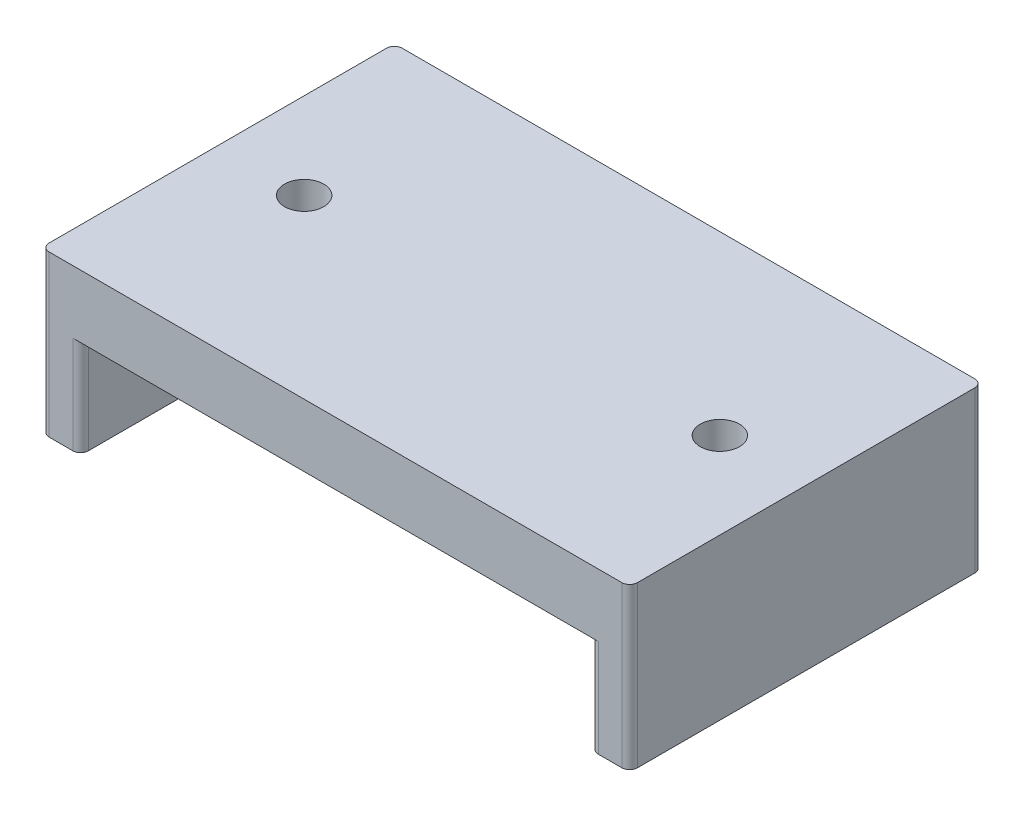
ISO-10303-21;
HEADER;
FILE_DESCRIPTION(('STEP AP214'),'2;1');
FILE_NAME('part.step','',(''),(''),'','','');
FILE_SCHEMA(('AUTOMOTIVE_DESIGN { 1 0 10303 214 1 1 1 1 }'));
ENDSEC;
DATA;
#1=APPLICATION_CONTEXT('core data for automotive mechanical design processes');
#2=APPLICATION_PROTOCOL_DEFINITION('international standard','automotive_design',2000,#1);
#3=PRODUCT_CONTEXT('',#1,'mechanical');
#4=PRODUCT('Part','Part','',(#3));
#5=PRODUCT_RELATED_PRODUCT_CATEGORY('part','',(#4));
#6=PRODUCT_DEFINITION_FORMATION('','',#4);
#7=PRODUCT_DEFINITION_CONTEXT('part definition',#1,'design');
#8=PRODUCT_DEFINITION('design','',#6,#7);
#9=PRODUCT_DEFINITION_SHAPE('','',#8);
#10=(LENGTH_UNIT() NAMED_UNIT(*) SI_UNIT(.MILLI.,.METRE.));
#11=(NAMED_UNIT(*) PLANE_ANGLE_UNIT() SI_UNIT($,.RADIAN.));
#12=(NAMED_UNIT(*) SI_UNIT($,.STERADIAN.) SOLID_ANGLE_UNIT());
#13=UNCERTAINTY_MEASURE_WITH_UNIT(LENGTH_MEASURE(1.E-05),#10,'distance_accuracy_value','');
#14=(GEOMETRIC_REPRESENTATION_CONTEXT(3) GLOBAL_UNCERTAINTY_ASSIGNED_CONTEXT((#13)) GLOBAL_UNIT_ASSIGNED_CONTEXT((#10,
#11,#12)) REPRESENTATION_CONTEXT('',''));
#15=CARTESIAN_POINT('',(0.,0.,0.));
#16=DIRECTION('',(0.,0.,1.));
#17=DIRECTION('',(1.,0.,0.));
#18=AXIS2_PLACEMENT_3D('',#15,#16,#17);
#19=CARTESIAN_POINT('',(0.,20.45,45.));
#20=DIRECTION('',(1.,0.,0.));
#21=DIRECTION('',(0.,1.,0.));
#22=AXIS2_PLACEMENT_3D('',#19,#20,#21);
#23=PLANE('',#22);
#24=DIRECTION('',(0.,0.,-1.));
#25=VECTOR('',#24,1.);
#26=CARTESIAN_POINT('',(0.,20.45,45.));
#27=LINE('',#26,#25);
#28=CARTESIAN_POINT('',(0.,20.45,44.));
#29=VERTEX_POINT('',#28);
#30=CARTESIAN_POINT('',(0.,20.45,1.00000000000001));
#31=VERTEX_POINT('',#30);
#32=EDGE_CURVE('E186',#29,#31,#27,.T.);
#33=ORIENTED_EDGE('',*,*,#32,.T.);
#34=DIRECTION('',(0.,-1.,0.));
#35=VECTOR('',#34,1.);
#36=CARTESIAN_POINT('',(0.,20.45,1.));
#37=LINE('',#36,#35);
#38=CARTESIAN_POINT('',(0.,0.,1.00000000000001));
#39=VERTEX_POINT('',#38);
#40=EDGE_CURVE('E266',#31,#39,#37,.T.);
#41=ORIENTED_EDGE('',*,*,#40,.T.);
#42=DIRECTION('',(0.,0.,-1.));
#43=VECTOR('',#42,1.);
#44=CARTESIAN_POINT('',(0.,0.,45.));
#45=LINE('',#44,#43);
#46=CARTESIAN_POINT('',(0.,0.,44.));
#47=VERTEX_POINT('',#46);
#48=EDGE_CURVE('E214',#47,#39,#45,.T.);
#49=ORIENTED_EDGE('',*,*,#48,.F.);
#50=DIRECTION('',(0.,-1.,0.));
#51=VECTOR('',#50,1.);
#52=CARTESIAN_POINT('',(0.,20.45,44.));
#53=LINE('',#52,#51);
#54=EDGE_CURVE('E151',#47,#29,#53,.F.);
#55=ORIENTED_EDGE('',*,*,#54,.T.);
#56=EDGE_LOOP('',(#33,#41,#49,#55));
#57=FACE_BOUND('',#56,.T.);
#58=ADVANCED_FACE('F33',(#57),#23,.F.);
#59=CARTESIAN_POINT('',(0.,0.,45.));
#60=DIRECTION('',(0.,1.,0.));
#61=DIRECTION('',(0.,0.,1.));
#62=AXIS2_PLACEMENT_3D('',#59,#60,#61);
#63=PLANE('',#62);
#64=DIRECTION('',(1.,0.,0.));
#65=VECTOR('',#64,1.);
#66=CARTESIAN_POINT('',(0.,0.,0.));
#67=LINE('',#66,#65);
#68=CARTESIAN_POINT('',(1.,0.,0.));
#69=VERTEX_POINT('',#68);
#70=CARTESIAN_POINT('',(4.,0.,0.));
#71=VERTEX_POINT('',#70);
#72=EDGE_CURVE('E187',#69,#71,#67,.T.);
#73=ORIENTED_EDGE('',*,*,#72,.T.);
#74=CARTESIAN_POINT('',(4.,0.,1.));
#75=DIRECTION('',(0.,1.,0.));
#76=DIRECTION('',(0.,0.,1.));
#77=AXIS2_PLACEMENT_3D('',#74,#75,#76);
#78=CIRCLE('',#77,1.);
#79=CARTESIAN_POINT('',(5.,0.,1.00000000000001));
#80=VERTEX_POINT('',#79);
#81=EDGE_CURVE('E263',#71,#80,#78,.F.);
#82=ORIENTED_EDGE('',*,*,#81,.T.);
#83=DIRECTION('',(0.,0.,-1.));
#84=VECTOR('',#83,1.);
#85=CARTESIAN_POINT('',(5.,0.,45.));
#86=LINE('',#85,#84);
#87=CARTESIAN_POINT('',(5.,0.,44.));
#88=VERTEX_POINT('',#87);
#89=EDGE_CURVE('E211',#88,#80,#86,.T.);
#90=ORIENTED_EDGE('',*,*,#89,.F.);
#91=CARTESIAN_POINT('',(4.,0.,44.));
#92=DIRECTION('',(0.,1.,0.));
#93=DIRECTION('',(0.,0.,1.));
#94=AXIS2_PLACEMENT_3D('',#91,#92,#93);
#95=CIRCLE('',#94,1.);
#96=CARTESIAN_POINT('',(4.,0.,45.));
#97=VERTEX_POINT('',#96);
#98=EDGE_CURVE('E152',#88,#97,#95,.F.);
#99=ORIENTED_EDGE('',*,*,#98,.T.);
#100=DIRECTION('',(1.,0.,0.));
#101=VECTOR('',#100,1.);
#102=CARTESIAN_POINT('',(0.,0.,45.));
#103=LINE('',#102,#101);
#104=CARTESIAN_POINT('',(1.,0.,45.));
#105=VERTEX_POINT('',#104);
#106=EDGE_CURVE('E159',#105,#97,#103,.T.);
#107=ORIENTED_EDGE('',*,*,#106,.F.);
#108=CARTESIAN_POINT('',(1.,0.,44.));
#109=DIRECTION('',(0.,1.,0.));
#110=DIRECTION('',(0.,0.,1.));
#111=AXIS2_PLACEMENT_3D('',#108,#109,#110);
#112=CIRCLE('',#111,1.);
#113=EDGE_CURVE('E56',#105,#47,#112,.F.);
#114=ORIENTED_EDGE('',*,*,#113,.T.);
#115=ORIENTED_EDGE('',*,*,#48,.T.);
#116=CARTESIAN_POINT('',(1.,0.,1.));
#117=DIRECTION('',(0.,1.,0.));
#118=DIRECTION('',(0.,0.,1.));
#119=AXIS2_PLACEMENT_3D('',#116,#117,#118);
#120=CIRCLE('',#119,1.);
#121=EDGE_CURVE('E48',#39,#69,#120,.F.);
#122=ORIENTED_EDGE('',*,*,#121,.T.);
#123=EDGE_LOOP('',(#73,#82,#90,#99,#107,#114,#115,#122));
#124=FACE_BOUND('',#123,.T.);
#125=ADVANCED_FACE('F168',(#124),#63,.F.);
#126=CARTESIAN_POINT('',(5.,0.,45.));
#127=DIRECTION('',(-1.,0.,0.));
#128=DIRECTION('',(0.,0.,1.));
#129=AXIS2_PLACEMENT_3D('',#126,#127,#128);
#130=PLANE('',#129);
#131=ORIENTED_EDGE('',*,*,#89,.T.);
#132=DIRECTION('',(0.,1.,0.));
#133=VECTOR('',#132,1.);
#134=CARTESIAN_POINT('',(5.,0.,1.));
#135=LINE('',#134,#133);
#136=CARTESIAN_POINT('',(5.,12.45,1.00000000000001));
#137=VERTEX_POINT('',#136);
#138=EDGE_CURVE('E258',#80,#137,#135,.T.);
#139=ORIENTED_EDGE('',*,*,#138,.T.);
#140=DIRECTION('',(0.,0.,-1.));
#141=VECTOR('',#140,1.);
#142=CARTESIAN_POINT('',(5.,12.45,45.));
#143=LINE('',#142,#141);
#144=CARTESIAN_POINT('',(5.,12.45,44.));
#145=VERTEX_POINT('',#144);
#146=EDGE_CURVE('E208',#145,#137,#143,.T.);
#147=ORIENTED_EDGE('',*,*,#146,.F.);
#148=DIRECTION('',(0.,1.,0.));
#149=VECTOR('',#148,1.);
#150=CARTESIAN_POINT('',(5.,0.,44.));
#151=LINE('',#150,#149);
#152=EDGE_CURVE('E256',#145,#88,#151,.F.);
#153=ORIENTED_EDGE('',*,*,#152,.T.);
#154=EDGE_LOOP('',(#131,#139,#147,#153));
#155=FACE_BOUND('',#154,.T.);
#156=ADVANCED_FACE('F327',(#155),#130,.F.);
#157=CARTESIAN_POINT('',(5.,12.45,45.));
#158=DIRECTION('',(0.,1.,0.));
#159=DIRECTION('',(0.,0.,1.));
#160=AXIS2_PLACEMENT_3D('',#157,#158,#159);
#161=PLANE('',#160);
#162=CARTESIAN_POINT('',(11.,12.45,22.5));
#163=DIRECTION('',(0.,-1.,0.));
#164=DIRECTION('',(0.,0.,-1.));
#165=AXIS2_PLACEMENT_3D('',#162,#163,#164);
#166=CIRCLE('',#165,2.49999999999999);
#167=CARTESIAN_POINT('',(11.,12.45,20.));
#168=VERTEX_POINT('',#167);
#169=EDGE_CURVE('E499',#168,#168,#166,.T.);
#170=ORIENTED_EDGE('',*,*,#169,.F.);
#171=EDGE_LOOP('',(#170));
#172=FACE_BOUND('',#171,.T.);
#173=CARTESIAN_POINT('',(64.,12.45,22.5));
#174=DIRECTION('',(0.,-1.,0.));
#175=DIRECTION('',(0.,0.,-1.));
#176=AXIS2_PLACEMENT_3D('',#173,#174,#175);
#177=CIRCLE('',#176,2.5);
#178=CARTESIAN_POINT('',(64.,12.45,20.));
#179=VERTEX_POINT('',#178);
#180=EDGE_CURVE('E180',#179,#179,#177,.T.);
#181=ORIENTED_EDGE('',*,*,#180,.F.);
#182=EDGE_LOOP('',(#181));
#183=FACE_BOUND('',#182,.T.);
#184=DIRECTION('',(1.,0.,0.));
#185=VECTOR('',#184,1.);
#186=CARTESIAN_POINT('',(5.,12.45,0.));
#187=LINE('',#186,#185);
#188=CARTESIAN_POINT('',(4.,12.45,0.));
#189=VERTEX_POINT('',#188);
#190=CARTESIAN_POINT('',(71.,12.45,0.));
#191=VERTEX_POINT('',#190);
#192=EDGE_CURVE('E189',#189,#191,#187,.T.);
#193=ORIENTED_EDGE('',*,*,#192,.T.);
#194=CARTESIAN_POINT('',(71.,12.45,1.));
#195=DIRECTION('',(0.,1.,0.));
#196=DIRECTION('',(0.,0.,1.));
#197=AXIS2_PLACEMENT_3D('',#194,#195,#196);
#198=CIRCLE('',#197,1.);
#199=CARTESIAN_POINT('',(70.,12.45,1.00000000000001));
#200=VERTEX_POINT('',#199);
#201=EDGE_CURVE('E271',#191,#200,#198,.T.);
#202=ORIENTED_EDGE('',*,*,#201,.T.);
#203=DIRECTION('',(0.,0.,-1.));
#204=VECTOR('',#203,1.);
#205=CARTESIAN_POINT('',(70.,12.45,45.));
#206=LINE('',#205,#204);
#207=CARTESIAN_POINT('',(70.,12.45,44.));
#208=VERTEX_POINT('',#207);
#209=EDGE_CURVE('E205',#208,#200,#206,.T.);
#210=ORIENTED_EDGE('',*,*,#209,.F.);
#211=CARTESIAN_POINT('',(71.,12.45,44.));
#212=DIRECTION('',(0.,1.,0.));
#213=DIRECTION('',(0.,0.,1.));
#214=AXIS2_PLACEMENT_3D('',#211,#212,#213);
#215=CIRCLE('',#214,1.);
#216=CARTESIAN_POINT('',(71.,12.45,45.));
#217=VERTEX_POINT('',#216);
#218=EDGE_CURVE('E268',#208,#217,#215,.T.);
#219=ORIENTED_EDGE('',*,*,#218,.T.);
#220=DIRECTION('',(1.,0.,0.));
#221=VECTOR('',#220,1.);
#222=CARTESIAN_POINT('',(5.,12.45,45.));
#223=LINE('',#222,#221);
#224=CARTESIAN_POINT('',(4.,12.45,45.));
#225=VERTEX_POINT('',#224);
#226=EDGE_CURVE('E171',#225,#217,#223,.T.);
#227=ORIENTED_EDGE('',*,*,#226,.F.);
#228=CARTESIAN_POINT('',(4.,12.45,44.));
#229=DIRECTION('',(0.,1.,0.));
#230=DIRECTION('',(0.,0.,1.));
#231=AXIS2_PLACEMENT_3D('',#228,#229,#230);
#232=CIRCLE('',#231,1.);
#233=EDGE_CURVE('E11',#225,#145,#232,.T.);
#234=ORIENTED_EDGE('',*,*,#233,.T.);
#235=ORIENTED_EDGE('',*,*,#146,.T.);
#236=CARTESIAN_POINT('',(4.,12.45,1.));
#237=DIRECTION('',(0.,1.,0.));
#238=DIRECTION('',(0.,0.,1.));
#239=AXIS2_PLACEMENT_3D('',#236,#237,#238);
#240=CIRCLE('',#239,1.);
#241=EDGE_CURVE('E41',#137,#189,#240,.T.);
#242=ORIENTED_EDGE('',*,*,#241,.T.);
#243=EDGE_LOOP('',(#193,#202,#210,#219,#227,#234,#235,#242));
#244=FACE_BOUND('',#243,.T.);
#245=ADVANCED_FACE('F275',(#172,#183,#244),#161,.F.);
#246=CARTESIAN_POINT('',(70.,12.45,45.));
#247=DIRECTION('',(1.,0.,0.));
#248=DIRECTION('',(0.,0.,-1.));
#249=AXIS2_PLACEMENT_3D('',#246,#247,#248);
#250=PLANE('',#249);
#251=DIRECTION('',(0.,0.,-1.));
#252=VECTOR('',#251,1.);
#253=CARTESIAN_POINT('',(70.,0.,45.));
#254=LINE('',#253,#252);
#255=CARTESIAN_POINT('',(70.,0.,44.));
#256=VERTEX_POINT('',#255);
#257=CARTESIAN_POINT('',(70.,0.,1.00000000000001));
#258=VERTEX_POINT('',#257);
#259=EDGE_CURVE('E202',#256,#258,#254,.T.);
#260=ORIENTED_EDGE('',*,*,#259,.F.);
#261=DIRECTION('',(0.,-1.,0.));
#262=VECTOR('',#261,1.);
#263=CARTESIAN_POINT('',(70.,12.45,44.));
#264=LINE('',#263,#262);
#265=EDGE_CURVE('E232',#256,#208,#264,.F.);
#266=ORIENTED_EDGE('',*,*,#265,.T.);
#267=ORIENTED_EDGE('',*,*,#209,.T.);
#268=DIRECTION('',(0.,-1.,0.));
#269=VECTOR('',#268,1.);
#270=CARTESIAN_POINT('',(70.,12.45,1.));
#271=LINE('',#270,#269);
#272=EDGE_CURVE('E229',#200,#258,#271,.T.);
#273=ORIENTED_EDGE('',*,*,#272,.T.);
#274=EDGE_LOOP('',(#260,#266,#267,#273));
#275=FACE_BOUND('',#274,.T.);
#276=ADVANCED_FACE('F316',(#275),#250,.F.);
#277=CARTESIAN_POINT('',(70.,0.,45.));
#278=DIRECTION('',(0.,1.,0.));
#279=DIRECTION('',(0.,0.,1.));
#280=AXIS2_PLACEMENT_3D('',#277,#278,#279);
#281=PLANE('',#280);
#282=DIRECTION('',(1.,0.,0.));
#283=VECTOR('',#282,1.);
#284=CARTESIAN_POINT('',(70.,0.,45.));
#285=LINE('',#284,#283);
#286=CARTESIAN_POINT('',(71.,0.,45.));
#287=VERTEX_POINT('',#286);
#288=CARTESIAN_POINT('',(74.,0.,45.));
#289=VERTEX_POINT('',#288);
#290=EDGE_CURVE('E174',#287,#289,#285,.T.);
#291=ORIENTED_EDGE('',*,*,#290,.F.);
#292=CARTESIAN_POINT('',(71.,0.,44.));
#293=DIRECTION('',(0.,1.,0.));
#294=DIRECTION('',(0.,0.,1.));
#295=AXIS2_PLACEMENT_3D('',#292,#293,#294);
#296=CIRCLE('',#295,1.);
#297=EDGE_CURVE('E227',#287,#256,#296,.F.);
#298=ORIENTED_EDGE('',*,*,#297,.T.);
#299=ORIENTED_EDGE('',*,*,#259,.T.);
#300=CARTESIAN_POINT('',(71.,0.,1.));
#301=DIRECTION('',(0.,1.,0.));
#302=DIRECTION('',(0.,0.,1.));
#303=AXIS2_PLACEMENT_3D('',#300,#301,#302);
#304=CIRCLE('',#303,1.);
#305=CARTESIAN_POINT('',(71.,0.,0.));
#306=VERTEX_POINT('',#305);
#307=EDGE_CURVE('E223',#258,#306,#304,.F.);
#308=ORIENTED_EDGE('',*,*,#307,.T.);
#309=DIRECTION('',(1.,0.,0.));
#310=VECTOR('',#309,1.);
#311=CARTESIAN_POINT('',(70.,0.,0.));
#312=LINE('',#311,#310);
#313=CARTESIAN_POINT('',(74.,0.,0.));
#314=VERTEX_POINT('',#313);
#315=EDGE_CURVE('E177',#306,#314,#312,.T.);
#316=ORIENTED_EDGE('',*,*,#315,.T.);
#317=CARTESIAN_POINT('',(74.,0.,1.));
#318=DIRECTION('',(0.,1.,0.));
#319=DIRECTION('',(0.,0.,1.));
#320=AXIS2_PLACEMENT_3D('',#317,#318,#319);
#321=CIRCLE('',#320,1.);
#322=CARTESIAN_POINT('',(75.,0.,1.00000000000001));
#323=VERTEX_POINT('',#322);
#324=EDGE_CURVE('E221',#314,#323,#321,.F.);
#325=ORIENTED_EDGE('',*,*,#324,.T.);
#326=DIRECTION('',(0.,0.,-1.));
#327=VECTOR('',#326,1.);
#328=CARTESIAN_POINT('',(75.,0.,45.));
#329=LINE('',#328,#327);
#330=CARTESIAN_POINT('',(75.,0.,44.));
#331=VERTEX_POINT('',#330);
#332=EDGE_CURVE('E199',#331,#323,#329,.T.);
#333=ORIENTED_EDGE('',*,*,#332,.F.);
#334=CARTESIAN_POINT('',(74.,0.,44.));
#335=DIRECTION('',(0.,1.,0.));
#336=DIRECTION('',(0.,0.,1.));
#337=AXIS2_PLACEMENT_3D('',#334,#335,#336);
#338=CIRCLE('',#337,1.);
#339=EDGE_CURVE('E225',#331,#289,#338,.F.);
#340=ORIENTED_EDGE('',*,*,#339,.T.);
#341=EDGE_LOOP('',(#291,#298,#299,#308,#316,#325,#333,#340));
#342=FACE_BOUND('',#341,.T.);
#343=ADVANCED_FACE('F300',(#342),#281,.F.);
#344=CARTESIAN_POINT('',(75.,0.,45.));
#345=DIRECTION('',(-1.,0.,0.));
#346=DIRECTION('',(0.,0.,1.));
#347=AXIS2_PLACEMENT_3D('',#344,#345,#346);
#348=PLANE('',#347);
#349=DIRECTION('',(0.,0.,-1.));
#350=VECTOR('',#349,1.);
#351=CARTESIAN_POINT('',(75.,20.45,45.));
#352=LINE('',#351,#350);
#353=CARTESIAN_POINT('',(75.,20.45,44.));
#354=VERTEX_POINT('',#353);
#355=CARTESIAN_POINT('',(75.,20.45,1.00000000000001));
#356=VERTEX_POINT('',#355);
#357=EDGE_CURVE('E196',#354,#356,#352,.T.);
#358=ORIENTED_EDGE('',*,*,#357,.F.);
#359=DIRECTION('',(0.,1.,0.));
#360=VECTOR('',#359,1.);
#361=CARTESIAN_POINT('',(75.,0.,44.));
#362=LINE('',#361,#360);
#363=EDGE_CURVE('E245',#354,#331,#362,.F.);
#364=ORIENTED_EDGE('',*,*,#363,.T.);
#365=ORIENTED_EDGE('',*,*,#332,.T.);
#366=DIRECTION('',(0.,1.,0.));
#367=VECTOR('',#366,1.);
#368=CARTESIAN_POINT('',(75.,0.,1.));
#369=LINE('',#368,#367);
#370=EDGE_CURVE('E242',#323,#356,#369,.T.);
#371=ORIENTED_EDGE('',*,*,#370,.T.);
#372=EDGE_LOOP('',(#358,#364,#365,#371));
#373=FACE_BOUND('',#372,.T.);
#374=ADVANCED_FACE('F304',(#373),#348,.F.);
#375=CARTESIAN_POINT('',(75.,20.45,45.));
#376=DIRECTION('',(0.,-1.,0.));
#377=DIRECTION('',(1.,0.,0.));
#378=AXIS2_PLACEMENT_3D('',#375,#376,#377);
#379=PLANE('',#378);
#380=CARTESIAN_POINT('',(11.,20.45,22.5));
#381=DIRECTION('',(0.,-1.,0.));
#382=DIRECTION('',(0.,0.,-1.));
#383=AXIS2_PLACEMENT_3D('',#380,#381,#382);
#384=CIRCLE('',#383,2.49999999999999);
#385=CARTESIAN_POINT('',(11.,20.45,20.));
#386=VERTEX_POINT('',#385);
#387=EDGE_CURVE('E190',#386,#386,#384,.T.);
#388=ORIENTED_EDGE('',*,*,#387,.T.);
#389=EDGE_LOOP('',(#388));
#390=FACE_BOUND('',#389,.T.);
#391=CARTESIAN_POINT('',(64.,20.45,22.5));
#392=DIRECTION('',(0.,-1.,0.));
#393=DIRECTION('',(0.,0.,-1.));
#394=AXIS2_PLACEMENT_3D('',#391,#392,#393);
#395=CIRCLE('',#394,2.5);
#396=CARTESIAN_POINT('',(64.,20.45,20.));
#397=VERTEX_POINT('',#396);
#398=EDGE_CURVE('E495',#397,#397,#395,.T.);
#399=ORIENTED_EDGE('',*,*,#398,.T.);
#400=EDGE_LOOP('',(#399));
#401=FACE_BOUND('',#400,.T.);
#402=DIRECTION('',(-1.,0.,0.));
#403=VECTOR('',#402,1.);
#404=CARTESIAN_POINT('',(75.,20.45,45.));
#405=LINE('',#404,#403);
#406=CARTESIAN_POINT('',(74.,20.45,45.));
#407=VERTEX_POINT('',#406);
#408=CARTESIAN_POINT('',(1.,20.45,45.));
#409=VERTEX_POINT('',#408);
#410=EDGE_CURVE('E163',#407,#409,#405,.T.);
#411=ORIENTED_EDGE('',*,*,#410,.F.);
#412=CARTESIAN_POINT('',(74.,20.45,44.));
#413=DIRECTION('',(0.,-1.,0.));
#414=DIRECTION('',(1.,0.,0.));
#415=AXIS2_PLACEMENT_3D('',#412,#413,#414);
#416=CIRCLE('',#415,1.);
#417=EDGE_CURVE('E240',#407,#354,#416,.F.);
#418=ORIENTED_EDGE('',*,*,#417,.T.);
#419=ORIENTED_EDGE('',*,*,#357,.T.);
#420=CARTESIAN_POINT('',(74.,20.45,1.));
#421=DIRECTION('',(0.,-1.,0.));
#422=DIRECTION('',(1.,0.,0.));
#423=AXIS2_PLACEMENT_3D('',#420,#421,#422);
#424=CIRCLE('',#423,1.);
#425=CARTESIAN_POINT('',(74.,20.45,0.));
#426=VERTEX_POINT('',#425);
#427=EDGE_CURVE('E238',#356,#426,#424,.F.);
#428=ORIENTED_EDGE('',*,*,#427,.T.);
#429=DIRECTION('',(-1.,0.,0.));
#430=VECTOR('',#429,1.);
#431=CARTESIAN_POINT('',(75.,20.45,0.));
#432=LINE('',#431,#430);
#433=CARTESIAN_POINT('',(1.,20.45,0.));
#434=VERTEX_POINT('',#433);
#435=EDGE_CURVE('E172',#426,#434,#432,.T.);
#436=ORIENTED_EDGE('',*,*,#435,.T.);
#437=CARTESIAN_POINT('',(1.,20.45,1.));
#438=DIRECTION('',(0.,-1.,0.));
#439=DIRECTION('',(1.,0.,0.));
#440=AXIS2_PLACEMENT_3D('',#437,#438,#439);
#441=CIRCLE('',#440,1.);
#442=EDGE_CURVE('E236',#434,#31,#441,.F.);
#443=ORIENTED_EDGE('',*,*,#442,.T.);
#444=ORIENTED_EDGE('',*,*,#32,.F.);
#445=CARTESIAN_POINT('',(1.,20.45,44.));
#446=DIRECTION('',(0.,-1.,0.));
#447=DIRECTION('',(1.,0.,0.));
#448=AXIS2_PLACEMENT_3D('',#445,#446,#447);
#449=CIRCLE('',#448,1.);
#450=EDGE_CURVE('E234',#29,#409,#449,.F.);
#451=ORIENTED_EDGE('',*,*,#450,.T.);
#452=EDGE_LOOP('',(#411,#418,#419,#428,#436,#443,#444,#451));
#453=FACE_BOUND('',#452,.T.);
#454=ADVANCED_FACE('F290',(#390,#401,#453),#379,.F.);
#455=CARTESIAN_POINT('',(0.,0.,45.));
#456=DIRECTION('',(0.,0.,1.));
#457=DIRECTION('',(1.,0.,0.));
#458=AXIS2_PLACEMENT_3D('',#455,#456,#457);
#459=PLANE('',#458);
#460=ORIENTED_EDGE('',*,*,#226,.T.);
#461=DIRECTION('',(0.,-1.,0.));
#462=VECTOR('',#461,1.);
#463=CARTESIAN_POINT('',(71.,0.,45.));
#464=LINE('',#463,#462);
#465=EDGE_CURVE('E218',#217,#287,#464,.T.);
#466=ORIENTED_EDGE('',*,*,#465,.T.);
#467=ORIENTED_EDGE('',*,*,#290,.T.);
#468=DIRECTION('',(0.,1.,0.));
#469=VECTOR('',#468,1.);
#470=CARTESIAN_POINT('',(74.,20.45,45.));
#471=LINE('',#470,#469);
#472=EDGE_CURVE('E164',#289,#407,#471,.T.);
#473=ORIENTED_EDGE('',*,*,#472,.T.);
#474=ORIENTED_EDGE('',*,*,#410,.T.);
#475=DIRECTION('',(0.,-1.,0.));
#476=VECTOR('',#475,1.);
#477=CARTESIAN_POINT('',(1.,0.,45.));
#478=LINE('',#477,#476);
#479=EDGE_CURVE('E150',#409,#105,#478,.T.);
#480=ORIENTED_EDGE('',*,*,#479,.T.);
#481=ORIENTED_EDGE('',*,*,#106,.T.);
#482=DIRECTION('',(0.,1.,0.));
#483=VECTOR('',#482,1.);
#484=CARTESIAN_POINT('',(4.,12.45,45.));
#485=LINE('',#484,#483);
#486=EDGE_CURVE('E165',#97,#225,#485,.T.);
#487=ORIENTED_EDGE('',*,*,#486,.T.);
#488=EDGE_LOOP('',(#460,#466,#467,#473,#474,#480,#481,#487));
#489=FACE_BOUND('',#488,.T.);
#490=ADVANCED_FACE('F157',(#489),#459,.T.);
#491=CARTESIAN_POINT('',(0.,0.,0.));
#492=DIRECTION('',(0.,0.,1.));
#493=DIRECTION('',(1.,0.,0.));
#494=AXIS2_PLACEMENT_3D('',#491,#492,#493);
#495=PLANE('',#494);
#496=ORIENTED_EDGE('',*,*,#315,.F.);
#497=DIRECTION('',(0.,-1.,0.));
#498=VECTOR('',#497,1.);
#499=CARTESIAN_POINT('',(71.,0.,0.));
#500=LINE('',#499,#498);
#501=EDGE_CURVE('E253',#306,#191,#500,.F.);
#502=ORIENTED_EDGE('',*,*,#501,.T.);
#503=ORIENTED_EDGE('',*,*,#192,.F.);
#504=DIRECTION('',(0.,1.,0.));
#505=VECTOR('',#504,1.);
#506=CARTESIAN_POINT('',(4.,0.,0.));
#507=LINE('',#506,#505);
#508=EDGE_CURVE('E249',#189,#71,#507,.F.);
#509=ORIENTED_EDGE('',*,*,#508,.T.);
#510=ORIENTED_EDGE('',*,*,#72,.F.);
#511=DIRECTION('',(0.,-1.,0.));
#512=VECTOR('',#511,1.);
#513=CARTESIAN_POINT('',(1.,0.,0.));
#514=LINE('',#513,#512);
#515=EDGE_CURVE('E247',#69,#434,#514,.F.);
#516=ORIENTED_EDGE('',*,*,#515,.T.);
#517=ORIENTED_EDGE('',*,*,#435,.F.);
#518=DIRECTION('',(0.,1.,0.));
#519=VECTOR('',#518,1.);
#520=CARTESIAN_POINT('',(74.,0.,0.));
#521=LINE('',#520,#519);
#522=EDGE_CURVE('E251',#426,#314,#521,.F.);
#523=ORIENTED_EDGE('',*,*,#522,.T.);
#524=EDGE_LOOP('',(#496,#502,#503,#509,#510,#516,#517,#523));
#525=FACE_BOUND('',#524,.T.);
#526=ADVANCED_FACE('F284',(#525),#495,.F.);
#527=CARTESIAN_POINT('',(64.,20.45,22.5));
#528=DIRECTION('',(0.,-1.,0.));
#529=DIRECTION('',(0.,0.,-1.));
#530=AXIS2_PLACEMENT_3D('',#527,#528,#529);
#531=CYLINDRICAL_SURFACE('',#530,2.5);
#532=ORIENTED_EDGE('',*,*,#398,.F.);
#533=EDGE_LOOP('',(#532));
#534=FACE_BOUND('',#533,.T.);
#535=ORIENTED_EDGE('',*,*,#180,.T.);
#536=EDGE_LOOP('',(#535));
#537=FACE_BOUND('',#536,.T.);
#538=ADVANCED_FACE('F411',(#534,#537),#531,.F.);
#539=CARTESIAN_POINT('',(11.,20.45,22.5));
#540=DIRECTION('',(0.,-1.,0.));
#541=DIRECTION('',(0.,0.,-1.));
#542=AXIS2_PLACEMENT_3D('',#539,#540,#541);
#543=CYLINDRICAL_SURFACE('',#542,2.49999999999999);
#544=ORIENTED_EDGE('',*,*,#387,.F.);
#545=EDGE_LOOP('',(#544));
#546=FACE_BOUND('',#545,.T.);
#547=ORIENTED_EDGE('',*,*,#169,.T.);
#548=EDGE_LOOP('',(#547));
#549=FACE_BOUND('',#548,.T.);
#550=ADVANCED_FACE('F344',(#546,#549),#543,.F.);
#551=CARTESIAN_POINT('',(71.,0.,44.));
#552=DIRECTION('',(0.,1.,0.));
#553=DIRECTION('',(0.,0.,1.));
#554=AXIS2_PLACEMENT_3D('',#551,#552,#553);
#555=CYLINDRICAL_SURFACE('',#554,1.);
#556=ORIENTED_EDGE('',*,*,#218,.F.);
#557=ORIENTED_EDGE('',*,*,#265,.F.);
#558=ORIENTED_EDGE('',*,*,#297,.F.);
#559=ORIENTED_EDGE('',*,*,#465,.F.);
#560=EDGE_LOOP('',(#556,#557,#558,#559));
#561=FACE_BOUND('',#560,.T.);
#562=ADVANCED_FACE('F312',(#561),#555,.T.);
#563=CARTESIAN_POINT('',(74.,0.,44.));
#564=DIRECTION('',(0.,-1.,0.));
#565=DIRECTION('',(0.,0.,-1.));
#566=AXIS2_PLACEMENT_3D('',#563,#564,#565);
#567=CYLINDRICAL_SURFACE('',#566,1.);
#568=ORIENTED_EDGE('',*,*,#339,.F.);
#569=ORIENTED_EDGE('',*,*,#363,.F.);
#570=ORIENTED_EDGE('',*,*,#417,.F.);
#571=ORIENTED_EDGE('',*,*,#472,.F.);
#572=EDGE_LOOP('',(#568,#569,#570,#571));
#573=FACE_BOUND('',#572,.T.);
#574=ADVANCED_FACE('F307',(#573),#567,.T.);
#575=CARTESIAN_POINT('',(71.,12.45,1.));
#576=DIRECTION('',(0.,-1.,0.));
#577=DIRECTION('',(0.,0.,-1.));
#578=AXIS2_PLACEMENT_3D('',#575,#576,#577);
#579=CYLINDRICAL_SURFACE('',#578,1.);
#580=ORIENTED_EDGE('',*,*,#201,.F.);
#581=ORIENTED_EDGE('',*,*,#501,.F.);
#582=ORIENTED_EDGE('',*,*,#307,.F.);
#583=ORIENTED_EDGE('',*,*,#272,.F.);
#584=EDGE_LOOP('',(#580,#581,#582,#583));
#585=FACE_BOUND('',#584,.T.);
#586=ADVANCED_FACE('F321',(#585),#579,.T.);
#587=CARTESIAN_POINT('',(74.,0.,1.));
#588=DIRECTION('',(0.,1.,0.));
#589=DIRECTION('',(0.,0.,1.));
#590=AXIS2_PLACEMENT_3D('',#587,#588,#589);
#591=CYLINDRICAL_SURFACE('',#590,1.);
#592=ORIENTED_EDGE('',*,*,#324,.F.);
#593=ORIENTED_EDGE('',*,*,#522,.F.);
#594=ORIENTED_EDGE('',*,*,#427,.F.);
#595=ORIENTED_EDGE('',*,*,#370,.F.);
#596=EDGE_LOOP('',(#592,#593,#594,#595));
#597=FACE_BOUND('',#596,.T.);
#598=ADVANCED_FACE('F295',(#597),#591,.T.);
#599=CARTESIAN_POINT('',(4.,0.,1.));
#600=DIRECTION('',(0.,1.,0.));
#601=DIRECTION('',(0.,0.,1.));
#602=AXIS2_PLACEMENT_3D('',#599,#600,#601);
#603=CYLINDRICAL_SURFACE('',#602,1.);
#604=ORIENTED_EDGE('',*,*,#81,.F.);
#605=ORIENTED_EDGE('',*,*,#508,.F.);
#606=ORIENTED_EDGE('',*,*,#241,.F.);
#607=ORIENTED_EDGE('',*,*,#138,.F.);
#608=EDGE_LOOP('',(#604,#605,#606,#607));
#609=FACE_BOUND('',#608,.T.);
#610=ADVANCED_FACE('F280',(#609),#603,.T.);
#611=CARTESIAN_POINT('',(1.,20.45,1.));
#612=DIRECTION('',(0.,-1.,0.));
#613=DIRECTION('',(1.,0.,0.));
#614=AXIS2_PLACEMENT_3D('',#611,#612,#613);
#615=CYLINDRICAL_SURFACE('',#614,1.);
#616=ORIENTED_EDGE('',*,*,#442,.F.);
#617=ORIENTED_EDGE('',*,*,#515,.F.);
#618=ORIENTED_EDGE('',*,*,#121,.F.);
#619=ORIENTED_EDGE('',*,*,#40,.F.);
#620=EDGE_LOOP('',(#616,#617,#618,#619));
#621=FACE_BOUND('',#620,.T.);
#622=ADVANCED_FACE('F288',(#621),#615,.T.);
#623=CARTESIAN_POINT('',(1.,0.,44.));
#624=DIRECTION('',(0.,1.,0.));
#625=DIRECTION('',(-1.,0.,0.));
#626=AXIS2_PLACEMENT_3D('',#623,#624,#625);
#627=CYLINDRICAL_SURFACE('',#626,1.);
#628=ORIENTED_EDGE('',*,*,#450,.F.);
#629=ORIENTED_EDGE('',*,*,#54,.F.);
#630=ORIENTED_EDGE('',*,*,#113,.F.);
#631=ORIENTED_EDGE('',*,*,#479,.F.);
#632=EDGE_LOOP('',(#628,#629,#630,#631));
#633=FACE_BOUND('',#632,.T.);
#634=ADVANCED_FACE('F149',(#633),#627,.T.);
#635=CARTESIAN_POINT('',(4.,0.,44.));
#636=DIRECTION('',(0.,-1.,0.));
#637=DIRECTION('',(0.,0.,-1.));
#638=AXIS2_PLACEMENT_3D('',#635,#636,#637);
#639=CYLINDRICAL_SURFACE('',#638,1.);
#640=ORIENTED_EDGE('',*,*,#98,.F.);
#641=ORIENTED_EDGE('',*,*,#152,.F.);
#642=ORIENTED_EDGE('',*,*,#233,.F.);
#643=ORIENTED_EDGE('',*,*,#486,.F.);
#644=EDGE_LOOP('',(#640,#641,#642,#643));
#645=FACE_BOUND('',#644,.T.);
#646=ADVANCED_FACE('F35',(#645),#639,.T.);
#647=CLOSED_SHELL('',(#58,#125,#156,#245,#276,#343,#374,#454,#490,#526,#538,#550,#562,#574,#586,
#598,#610,#622,#634,#646));
#648=MANIFOLD_SOLID_BREP('B2',#647);
#649=ADVANCED_BREP_SHAPE_REPRESENTATION('',(#18,#648),#14);
#650=SHAPE_DEFINITION_REPRESENTATION(#9,#649);
ENDSEC;
END-ISO-10303-21;
